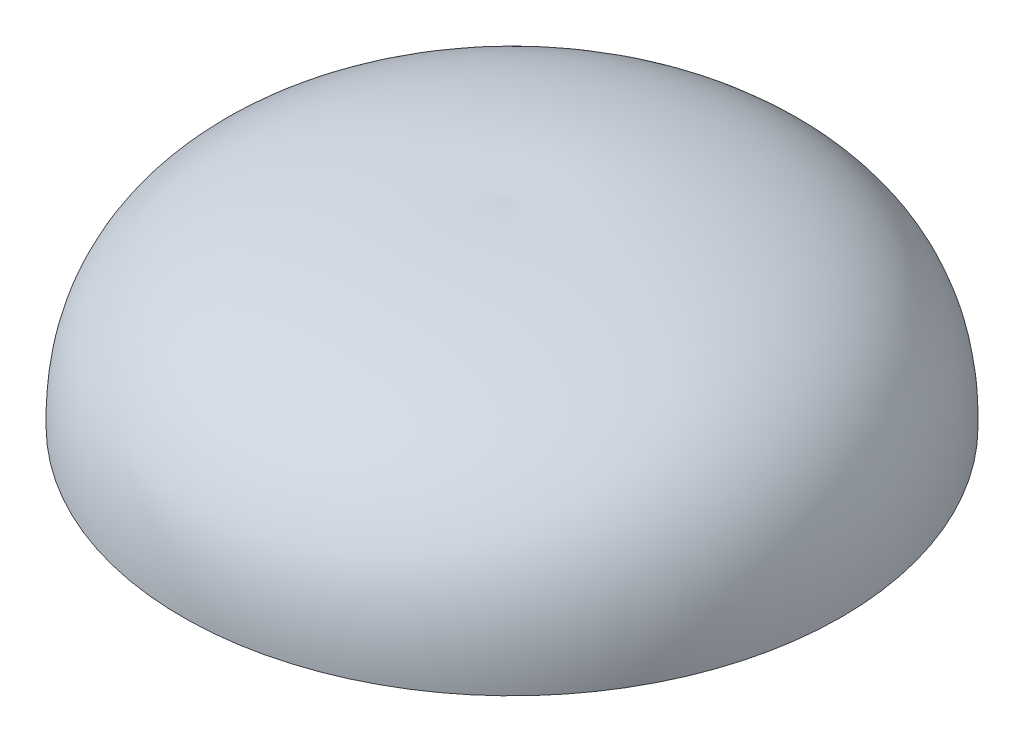
ISO-10303-21;
HEADER;
FILE_DESCRIPTION(('STEP AP214'),'2;1');
FILE_NAME('part.step','',(''),(''),'','','');
FILE_SCHEMA(('AUTOMOTIVE_DESIGN { 1 0 10303 214 1 1 1 1 }'));
ENDSEC;
DATA;
#1=APPLICATION_CONTEXT('core data for automotive mechanical design processes');
#2=APPLICATION_PROTOCOL_DEFINITION('international standard','automotive_design',2000,#1);
#3=PRODUCT_CONTEXT('',#1,'mechanical');
#4=PRODUCT('Part','Part','',(#3));
#5=PRODUCT_RELATED_PRODUCT_CATEGORY('part','',(#4));
#6=PRODUCT_DEFINITION_FORMATION('','',#4);
#7=PRODUCT_DEFINITION_CONTEXT('part definition',#1,'design');
#8=PRODUCT_DEFINITION('design','',#6,#7);
#9=PRODUCT_DEFINITION_SHAPE('','',#8);
#10=(LENGTH_UNIT() NAMED_UNIT(*) SI_UNIT(.MILLI.,.METRE.));
#11=(NAMED_UNIT(*) PLANE_ANGLE_UNIT() SI_UNIT($,.RADIAN.));
#12=(NAMED_UNIT(*) SI_UNIT($,.STERADIAN.) SOLID_ANGLE_UNIT());
#13=UNCERTAINTY_MEASURE_WITH_UNIT(LENGTH_MEASURE(1.E-05),#10,'distance_accuracy_value','');
#14=(GEOMETRIC_REPRESENTATION_CONTEXT(3) GLOBAL_UNCERTAINTY_ASSIGNED_CONTEXT((#13)) GLOBAL_UNIT_ASSIGNED_CONTEXT((#10,
#11,#12)) REPRESENTATION_CONTEXT('',''));
#15=CARTESIAN_POINT('',(0.,0.,0.));
#16=DIRECTION('',(0.,0.,1.));
#17=DIRECTION('',(1.,0.,0.));
#18=AXIS2_PLACEMENT_3D('',#15,#16,#17);
#19=CARTESIAN_POINT('',(0.,0.,0.));
#20=DIRECTION('',(0.,-1.,0.));
#21=DIRECTION('',(0.,0.,-1.));
#22=AXIS2_PLACEMENT_3D('',#19,#20,#21);
#23=PLANE('',#22);
#24=CARTESIAN_POINT('',(0.,0.,0.));
#25=DIRECTION('',(0.,-1.,0.));
#26=DIRECTION('',(0.,0.,-1.));
#27=AXIS2_PLACEMENT_3D('',#24,#25,#26);
#28=CIRCLE('',#27,25.);
#29=CARTESIAN_POINT('',(0.,0.,-25.));
#30=VERTEX_POINT('',#29);
#31=EDGE_CURVE('E13',#30,#30,#28,.T.);
#32=ORIENTED_EDGE('',*,*,#31,.T.);
#33=EDGE_LOOP('',(#32));
#34=FACE_BOUND('',#33,.T.);
#35=ADVANCED_FACE('F46',(#34),#23,.T.);
#36=CARTESIAN_POINT('',(25.,-1.11022302462516E-13,0.));
#37=CARTESIAN_POINT('',(25.2542524298803,9.13904921956155,1.11022302462516E-13));
#38=CARTESIAN_POINT('',(14.9664457490051,14.589548554677,1.11022302462516E-13));
#39=CARTESIAN_POINT('',(4.18717185387121,15.2786942666445,1.11022302462516E-13));
#40=CARTESIAN_POINT('',(0.,14.9999999999999,1.11022302462516E-13));
#41=B_SPLINE_CURVE_WITH_KNOTS('',3,(#36,#37,#38,#39,#40),.UNSPECIFIED.,.F.,.F.,(4,1,4),(0.,
0.613760782289888,1.),.UNSPECIFIED.);
#42=CARTESIAN_POINT('',(0.,0.,0.));
#43=DIRECTION('',(0.,-1.,0.));
#44=AXIS1_PLACEMENT('',#42,#43);
#45=SURFACE_OF_REVOLUTION('',#41,#44);
#46=CARTESIAN_POINT('',(0.,14.9999999999999,1.11022302462516E-13));
#47=VERTEX_POINT('',#46);
#48=VERTEX_LOOP('',#47);
#49=FACE_BOUND('',#48,.T.);
#50=ORIENTED_EDGE('',*,*,#31,.F.);
#51=EDGE_LOOP('',(#50));
#52=FACE_BOUND('',#51,.T.);
#53=ADVANCED_FACE('F54',(#49,#52),#45,.F.);
#54=CLOSED_SHELL('',(#35,#53));
#55=MANIFOLD_SOLID_BREP('B2',#54);
#56=ADVANCED_BREP_SHAPE_REPRESENTATION('',(#18,#55),#14);
#57=SHAPE_DEFINITION_REPRESENTATION(#9,#56);
ENDSEC;
END-ISO-10303-21;
